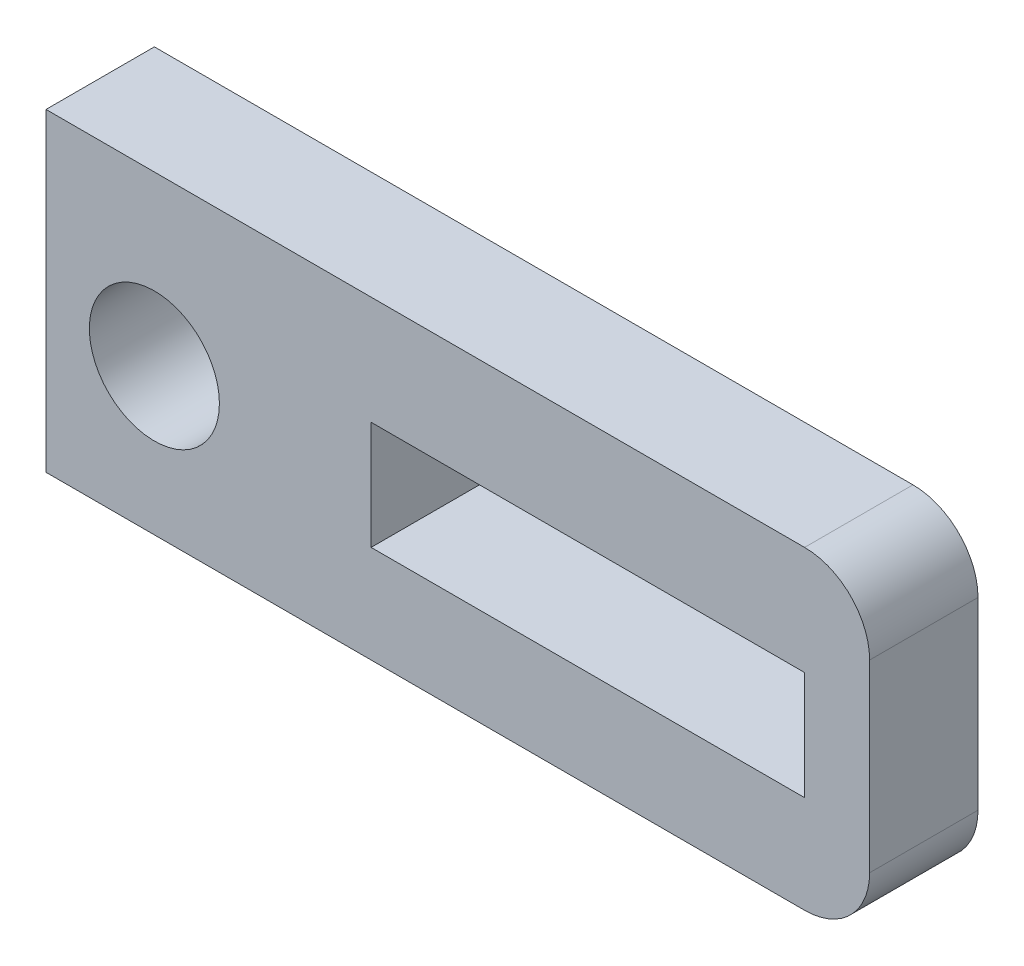
ISO-10303-21;
HEADER;
FILE_DESCRIPTION(('STEP AP214'),'2;1');
FILE_NAME('part.step','',(''),(''),'','','');
FILE_SCHEMA(('AUTOMOTIVE_DESIGN { 1 0 10303 214 1 1 1 1 }'));
ENDSEC;
DATA;
#1=APPLICATION_CONTEXT('core data for automotive mechanical design processes');
#2=APPLICATION_PROTOCOL_DEFINITION('international standard','automotive_design',2000,#1);
#3=PRODUCT_CONTEXT('',#1,'mechanical');
#4=PRODUCT('Part','Part','',(#3));
#5=PRODUCT_RELATED_PRODUCT_CATEGORY('part','',(#4));
#6=PRODUCT_DEFINITION_FORMATION('','',#4);
#7=PRODUCT_DEFINITION_CONTEXT('part definition',#1,'design');
#8=PRODUCT_DEFINITION('design','',#6,#7);
#9=PRODUCT_DEFINITION_SHAPE('','',#8);
#10=(LENGTH_UNIT() NAMED_UNIT(*) SI_UNIT(.MILLI.,.METRE.));
#11=(NAMED_UNIT(*) PLANE_ANGLE_UNIT() SI_UNIT($,.RADIAN.));
#12=(NAMED_UNIT(*) SI_UNIT($,.STERADIAN.) SOLID_ANGLE_UNIT());
#13=UNCERTAINTY_MEASURE_WITH_UNIT(LENGTH_MEASURE(1.E-05),#10,'distance_accuracy_value','');
#14=(GEOMETRIC_REPRESENTATION_CONTEXT(3) GLOBAL_UNCERTAINTY_ASSIGNED_CONTEXT((#13)) GLOBAL_UNIT_ASSIGNED_CONTEXT((#10,
#11,#12)) REPRESENTATION_CONTEXT('',''));
#15=CARTESIAN_POINT('',(0.,0.,0.));
#16=DIRECTION('',(0.,0.,1.));
#17=DIRECTION('',(1.,0.,0.));
#18=AXIS2_PLACEMENT_3D('',#15,#16,#17);
#19=CARTESIAN_POINT('',(57.,0.,5.));
#20=DIRECTION('',(1.,0.,0.));
#21=DIRECTION('',(0.,1.,0.));
#22=AXIS2_PLACEMENT_3D('',#19,#20,#21);
#23=PLANE('',#22);
#24=DIRECTION('',(0.,-1.,0.));
#25=VECTOR('',#24,1.);
#26=CARTESIAN_POINT('',(57.,0.,0.));
#27=LINE('',#26,#25);
#28=CARTESIAN_POINT('',(57.,9.99999999999999,0.));
#29=VERTEX_POINT('',#28);
#30=CARTESIAN_POINT('',(57.,5.,0.));
#31=VERTEX_POINT('',#30);
#32=EDGE_CURVE('E167',#29,#31,#27,.T.);
#33=ORIENTED_EDGE('',*,*,#32,.F.);
#34=DIRECTION('',(0.,0.,-1.));
#35=VECTOR('',#34,1.);
#36=CARTESIAN_POINT('',(57.,9.99999999999999,5.));
#37=LINE('',#36,#35);
#38=CARTESIAN_POINT('',(57.,9.99999999999999,5.));
#39=VERTEX_POINT('',#38);
#40=EDGE_CURVE('E11',#39,#29,#37,.T.);
#41=ORIENTED_EDGE('',*,*,#40,.F.);
#42=DIRECTION('',(0.,-1.,0.));
#43=VECTOR('',#42,1.);
#44=CARTESIAN_POINT('',(57.,0.,5.));
#45=LINE('',#44,#43);
#46=CARTESIAN_POINT('',(57.,5.,5.));
#47=VERTEX_POINT('',#46);
#48=EDGE_CURVE('E138',#39,#47,#45,.T.);
#49=ORIENTED_EDGE('',*,*,#48,.T.);
#50=DIRECTION('',(0.,0.,-1.));
#51=VECTOR('',#50,1.);
#52=CARTESIAN_POINT('',(57.,5.,5.));
#53=LINE('',#52,#51);
#54=EDGE_CURVE('E94',#47,#31,#53,.T.);
#55=ORIENTED_EDGE('',*,*,#54,.T.);
#56=EDGE_LOOP('',(#33,#41,#49,#55));
#57=FACE_BOUND('',#56,.T.);
#58=ADVANCED_FACE('F34',(#57),#23,.T.);
#59=CARTESIAN_POINT('',(0.,9.99999999999999,5.));
#60=DIRECTION('',(0.,-1.,0.));
#61=DIRECTION('',(1.,0.,0.));
#62=AXIS2_PLACEMENT_3D('',#59,#60,#61);
#63=PLANE('',#62);
#64=DIRECTION('',(-1.,0.,0.));
#65=VECTOR('',#64,1.);
#66=CARTESIAN_POINT('',(0.,9.99999999999999,0.));
#67=LINE('',#66,#65);
#68=CARTESIAN_POINT('',(77.,10.,0.));
#69=VERTEX_POINT('',#68);
#70=EDGE_CURVE('E128',#69,#29,#67,.T.);
#71=ORIENTED_EDGE('',*,*,#70,.F.);
#72=DIRECTION('',(0.,0.,-1.));
#73=VECTOR('',#72,1.);
#74=CARTESIAN_POINT('',(77.,10.,5.));
#75=LINE('',#74,#73);
#76=CARTESIAN_POINT('',(77.,10.,5.));
#77=VERTEX_POINT('',#76);
#78=EDGE_CURVE('E44',#77,#69,#75,.T.);
#79=ORIENTED_EDGE('',*,*,#78,.F.);
#80=DIRECTION('',(-1.,0.,0.));
#81=VECTOR('',#80,1.);
#82=CARTESIAN_POINT('',(0.,9.99999999999999,5.));
#83=LINE('',#82,#81);
#84=EDGE_CURVE('E126',#77,#39,#83,.T.);
#85=ORIENTED_EDGE('',*,*,#84,.T.);
#86=ORIENTED_EDGE('',*,*,#40,.T.);
#87=EDGE_LOOP('',(#71,#79,#85,#86));
#88=FACE_BOUND('',#87,.T.);
#89=ADVANCED_FACE('F124',(#88),#63,.T.);
#90=CARTESIAN_POINT('',(77.,0.,5.));
#91=DIRECTION('',(1.,0.,0.));
#92=DIRECTION('',(0.,0.,-1.));
#93=AXIS2_PLACEMENT_3D('',#90,#91,#92);
#94=PLANE('',#93);
#95=DIRECTION('',(0.,-1.,0.));
#96=VECTOR('',#95,1.);
#97=CARTESIAN_POINT('',(77.,0.,0.));
#98=LINE('',#97,#96);
#99=CARTESIAN_POINT('',(77.,5.,0.));
#100=VERTEX_POINT('',#99);
#101=EDGE_CURVE('E170',#69,#100,#98,.T.);
#102=ORIENTED_EDGE('',*,*,#101,.T.);
#103=DIRECTION('',(0.,0.,-1.));
#104=VECTOR('',#103,1.);
#105=CARTESIAN_POINT('',(77.,5.,5.));
#106=LINE('',#105,#104);
#107=CARTESIAN_POINT('',(77.,5.,5.));
#108=VERTEX_POINT('',#107);
#109=EDGE_CURVE('E131',#108,#100,#106,.T.);
#110=ORIENTED_EDGE('',*,*,#109,.F.);
#111=DIRECTION('',(0.,-1.,0.));
#112=VECTOR('',#111,1.);
#113=CARTESIAN_POINT('',(77.,0.,5.));
#114=LINE('',#113,#112);
#115=EDGE_CURVE('E134',#77,#108,#114,.T.);
#116=ORIENTED_EDGE('',*,*,#115,.F.);
#117=ORIENTED_EDGE('',*,*,#78,.T.);
#118=EDGE_LOOP('',(#102,#110,#116,#117));
#119=FACE_BOUND('',#118,.T.);
#120=ADVANCED_FACE('F135',(#119),#94,.F.);
#121=CARTESIAN_POINT('',(77.,3.5,5.));
#122=DIRECTION('',(0.,0.,-1.));
#123=DIRECTION('',(-1.,0.,0.));
#124=AXIS2_PLACEMENT_3D('',#121,#122,#123);
#125=CYLINDRICAL_SURFACE('',#124,3.);
#126=CARTESIAN_POINT('',(77.,3.5,0.));
#127=DIRECTION('',(0.,0.,1.));
#128=DIRECTION('',(1.,0.,0.));
#129=AXIS2_PLACEMENT_3D('',#126,#127,#128);
#130=CIRCLE('',#129,3.);
#131=CARTESIAN_POINT('',(80.,3.5,0.));
#132=VERTEX_POINT('',#131);
#133=CARTESIAN_POINT('',(77.,0.499999999999999,0.));
#134=VERTEX_POINT('',#133);
#135=EDGE_CURVE('E149',#132,#134,#130,.F.);
#136=ORIENTED_EDGE('',*,*,#135,.F.);
#137=DIRECTION('',(0.,0.,-1.));
#138=VECTOR('',#137,1.);
#139=CARTESIAN_POINT('',(80.,3.5,5.));
#140=LINE('',#139,#138);
#141=CARTESIAN_POINT('',(80.,3.5,5.));
#142=VERTEX_POINT('',#141);
#143=EDGE_CURVE('E38',#142,#132,#140,.T.);
#144=ORIENTED_EDGE('',*,*,#143,.F.);
#145=CARTESIAN_POINT('',(77.,3.5,5.));
#146=DIRECTION('',(0.,0.,1.));
#147=DIRECTION('',(1.,0.,0.));
#148=AXIS2_PLACEMENT_3D('',#145,#146,#147);
#149=CIRCLE('',#148,3.);
#150=CARTESIAN_POINT('',(77.,0.499999999999999,5.));
#151=VERTEX_POINT('',#150);
#152=EDGE_CURVE('E197',#142,#151,#149,.F.);
#153=ORIENTED_EDGE('',*,*,#152,.T.);
#154=DIRECTION('',(0.,0.,-1.));
#155=VECTOR('',#154,1.);
#156=CARTESIAN_POINT('',(77.,0.499999999999999,5.));
#157=LINE('',#156,#155);
#158=EDGE_CURVE('E145',#151,#134,#157,.T.);
#159=ORIENTED_EDGE('',*,*,#158,.T.);
#160=EDGE_LOOP('',(#136,#144,#153,#159));
#161=FACE_BOUND('',#160,.T.);
#162=ADVANCED_FACE('F195',(#161),#125,.T.);
#163=CARTESIAN_POINT('',(80.,0.,5.));
#164=DIRECTION('',(-1.,0.,0.));
#165=DIRECTION('',(0.,0.,1.));
#166=AXIS2_PLACEMENT_3D('',#163,#164,#165);
#167=PLANE('',#166);
#168=DIRECTION('',(0.,1.,0.));
#169=VECTOR('',#168,1.);
#170=CARTESIAN_POINT('',(80.,0.,0.));
#171=LINE('',#170,#169);
#172=CARTESIAN_POINT('',(80.,12.,0.));
#173=VERTEX_POINT('',#172);
#174=EDGE_CURVE('E152',#132,#173,#171,.T.);
#175=ORIENTED_EDGE('',*,*,#174,.T.);
#176=DIRECTION('',(0.,0.,-1.));
#177=VECTOR('',#176,1.);
#178=CARTESIAN_POINT('',(80.,12.,5.));
#179=LINE('',#178,#177);
#180=CARTESIAN_POINT('',(80.,12.,5.));
#181=VERTEX_POINT('',#180);
#182=EDGE_CURVE('E183',#181,#173,#179,.T.);
#183=ORIENTED_EDGE('',*,*,#182,.F.);
#184=DIRECTION('',(0.,1.,0.));
#185=VECTOR('',#184,1.);
#186=CARTESIAN_POINT('',(80.,0.,5.));
#187=LINE('',#186,#185);
#188=EDGE_CURVE('E191',#142,#181,#187,.T.);
#189=ORIENTED_EDGE('',*,*,#188,.F.);
#190=ORIENTED_EDGE('',*,*,#143,.T.);
#191=EDGE_LOOP('',(#175,#183,#189,#190));
#192=FACE_BOUND('',#191,.T.);
#193=ADVANCED_FACE('F189',(#192),#167,.F.);
#194=CARTESIAN_POINT('',(77.,12.,5.));
#195=DIRECTION('',(0.,0.,-1.));
#196=DIRECTION('',(-1.,0.,0.));
#197=AXIS2_PLACEMENT_3D('',#194,#195,#196);
#198=CYLINDRICAL_SURFACE('',#197,3.);
#199=CARTESIAN_POINT('',(77.,12.,0.));
#200=DIRECTION('',(0.,0.,1.));
#201=DIRECTION('',(1.,0.,0.));
#202=AXIS2_PLACEMENT_3D('',#199,#200,#201);
#203=CIRCLE('',#202,3.);
#204=CARTESIAN_POINT('',(77.,15.,0.));
#205=VERTEX_POINT('',#204);
#206=EDGE_CURVE('E155',#173,#205,#203,.T.);
#207=ORIENTED_EDGE('',*,*,#206,.T.);
#208=DIRECTION('',(0.,0.,-1.));
#209=VECTOR('',#208,1.);
#210=CARTESIAN_POINT('',(77.,15.,5.));
#211=LINE('',#210,#209);
#212=CARTESIAN_POINT('',(77.,15.,5.));
#213=VERTEX_POINT('',#212);
#214=EDGE_CURVE('E182',#213,#205,#211,.T.);
#215=ORIENTED_EDGE('',*,*,#214,.F.);
#216=CARTESIAN_POINT('',(77.,12.,5.));
#217=DIRECTION('',(0.,0.,1.));
#218=DIRECTION('',(1.,0.,0.));
#219=AXIS2_PLACEMENT_3D('',#216,#217,#218);
#220=CIRCLE('',#219,3.);
#221=EDGE_CURVE('E336',#181,#213,#220,.T.);
#222=ORIENTED_EDGE('',*,*,#221,.F.);
#223=ORIENTED_EDGE('',*,*,#182,.T.);
#224=EDGE_LOOP('',(#207,#215,#222,#223));
#225=FACE_BOUND('',#224,.T.);
#226=ADVANCED_FACE('F211',(#225),#198,.T.);
#227=CARTESIAN_POINT('',(0.,15.,5.));
#228=DIRECTION('',(0.,1.,0.));
#229=DIRECTION('',(-1.,0.,0.));
#230=AXIS2_PLACEMENT_3D('',#227,#228,#229);
#231=PLANE('',#230);
#232=DIRECTION('',(1.,0.,0.));
#233=VECTOR('',#232,1.);
#234=CARTESIAN_POINT('',(0.,15.,0.));
#235=LINE('',#234,#233);
#236=CARTESIAN_POINT('',(42.,15.,0.));
#237=VERTEX_POINT('',#236);
#238=EDGE_CURVE('E158',#237,#205,#235,.T.);
#239=ORIENTED_EDGE('',*,*,#238,.F.);
#240=DIRECTION('',(0.,0.,-1.));
#241=VECTOR('',#240,1.);
#242=CARTESIAN_POINT('',(42.,15.,5.));
#243=LINE('',#242,#241);
#244=CARTESIAN_POINT('',(42.,15.,5.));
#245=VERTEX_POINT('',#244);
#246=EDGE_CURVE('E180',#245,#237,#243,.T.);
#247=ORIENTED_EDGE('',*,*,#246,.F.);
#248=DIRECTION('',(1.,0.,0.));
#249=VECTOR('',#248,1.);
#250=CARTESIAN_POINT('',(0.,15.,5.));
#251=LINE('',#250,#249);
#252=EDGE_CURVE('E210',#245,#213,#251,.T.);
#253=ORIENTED_EDGE('',*,*,#252,.T.);
#254=ORIENTED_EDGE('',*,*,#214,.T.);
#255=EDGE_LOOP('',(#239,#247,#253,#254));
#256=FACE_BOUND('',#255,.T.);
#257=ADVANCED_FACE('F205',(#256),#231,.T.);
#258=CARTESIAN_POINT('',(42.,0.,5.));
#259=DIRECTION('',(1.,0.,0.));
#260=DIRECTION('',(0.,1.,0.));
#261=AXIS2_PLACEMENT_3D('',#258,#259,#260);
#262=PLANE('',#261);
#263=DIRECTION('',(0.,-1.,0.));
#264=VECTOR('',#263,1.);
#265=CARTESIAN_POINT('',(42.,0.,0.));
#266=LINE('',#265,#264);
#267=CARTESIAN_POINT('',(42.,0.499999999999999,0.));
#268=VERTEX_POINT('',#267);
#269=EDGE_CURVE('E161',#237,#268,#266,.T.);
#270=ORIENTED_EDGE('',*,*,#269,.T.);
#271=DIRECTION('',(0.,0.,-1.));
#272=VECTOR('',#271,1.);
#273=CARTESIAN_POINT('',(42.,0.499999999999999,5.));
#274=LINE('',#273,#272);
#275=CARTESIAN_POINT('',(42.,0.499999999999999,5.));
#276=VERTEX_POINT('',#275);
#277=EDGE_CURVE('E177',#276,#268,#274,.T.);
#278=ORIENTED_EDGE('',*,*,#277,.F.);
#279=DIRECTION('',(0.,-1.,0.));
#280=VECTOR('',#279,1.);
#281=CARTESIAN_POINT('',(42.,0.,5.));
#282=LINE('',#281,#280);
#283=EDGE_CURVE('E342',#245,#276,#282,.T.);
#284=ORIENTED_EDGE('',*,*,#283,.F.);
#285=ORIENTED_EDGE('',*,*,#246,.T.);
#286=EDGE_LOOP('',(#270,#278,#284,#285));
#287=FACE_BOUND('',#286,.T.);
#288=ADVANCED_FACE('F218',(#287),#262,.F.);
#289=CARTESIAN_POINT('',(0.,0.499999999999999,5.));
#290=DIRECTION('',(0.,1.,0.));
#291=DIRECTION('',(0.,0.,1.));
#292=AXIS2_PLACEMENT_3D('',#289,#290,#291);
#293=PLANE('',#292);
#294=DIRECTION('',(1.,0.,0.));
#295=VECTOR('',#294,1.);
#296=CARTESIAN_POINT('',(0.,0.499999999999999,0.));
#297=LINE('',#296,#295);
#298=EDGE_CURVE('E164',#268,#134,#297,.T.);
#299=ORIENTED_EDGE('',*,*,#298,.T.);
#300=ORIENTED_EDGE('',*,*,#158,.F.);
#301=DIRECTION('',(1.,0.,0.));
#302=VECTOR('',#301,1.);
#303=CARTESIAN_POINT('',(0.,0.499999999999999,5.));
#304=LINE('',#303,#302);
#305=EDGE_CURVE('E140',#276,#151,#304,.T.);
#306=ORIENTED_EDGE('',*,*,#305,.F.);
#307=ORIENTED_EDGE('',*,*,#277,.T.);
#308=EDGE_LOOP('',(#299,#300,#306,#307));
#309=FACE_BOUND('',#308,.T.);
#310=ADVANCED_FACE('F199',(#309),#293,.F.);
#311=CARTESIAN_POINT('',(47.,7.25,5.));
#312=DIRECTION('',(0.,0.,-1.));
#313=DIRECTION('',(-1.,0.,0.));
#314=AXIS2_PLACEMENT_3D('',#311,#312,#313);
#315=CYLINDRICAL_SURFACE('',#314,3.);
#316=CARTESIAN_POINT('',(47.,7.25,5.));
#317=DIRECTION('',(0.,0.,1.));
#318=DIRECTION('',(1.,0.,0.));
#319=AXIS2_PLACEMENT_3D('',#316,#317,#318);
#320=CIRCLE('',#319,3.);
#321=CARTESIAN_POINT('',(50.,7.25,5.));
#322=VERTEX_POINT('',#321);
#323=EDGE_CURVE('E173',#322,#322,#320,.T.);
#324=ORIENTED_EDGE('',*,*,#323,.T.);
#325=EDGE_LOOP('',(#324));
#326=FACE_BOUND('',#325,.T.);
#327=CARTESIAN_POINT('',(47.,7.25,0.));
#328=DIRECTION('',(0.,0.,1.));
#329=DIRECTION('',(1.,0.,0.));
#330=AXIS2_PLACEMENT_3D('',#327,#328,#329);
#331=CIRCLE('',#330,3.);
#332=CARTESIAN_POINT('',(50.,7.25,0.));
#333=VERTEX_POINT('',#332);
#334=EDGE_CURVE('E146',#333,#333,#331,.T.);
#335=ORIENTED_EDGE('',*,*,#334,.F.);
#336=EDGE_LOOP('',(#335));
#337=FACE_BOUND('',#336,.T.);
#338=ADVANCED_FACE('F36',(#326,#337),#315,.F.);
#339=CARTESIAN_POINT('',(0.,4.99999999999999,5.));
#340=DIRECTION('',(0.,-1.,0.));
#341=DIRECTION('',(1.,0.,0.));
#342=AXIS2_PLACEMENT_3D('',#339,#340,#341);
#343=PLANE('',#342);
#344=DIRECTION('',(-1.,0.,0.));
#345=VECTOR('',#344,1.);
#346=CARTESIAN_POINT('',(0.,4.99999999999999,0.));
#347=LINE('',#346,#345);
#348=EDGE_CURVE('E87',#100,#31,#347,.T.);
#349=ORIENTED_EDGE('',*,*,#348,.T.);
#350=ORIENTED_EDGE('',*,*,#54,.F.);
#351=DIRECTION('',(-1.,0.,0.));
#352=VECTOR('',#351,1.);
#353=CARTESIAN_POINT('',(0.,4.99999999999999,5.));
#354=LINE('',#353,#352);
#355=EDGE_CURVE('E53',#108,#47,#354,.T.);
#356=ORIENTED_EDGE('',*,*,#355,.F.);
#357=ORIENTED_EDGE('',*,*,#109,.T.);
#358=EDGE_LOOP('',(#349,#350,#356,#357));
#359=FACE_BOUND('',#358,.T.);
#360=ADVANCED_FACE('F246',(#359),#343,.F.);
#361=CARTESIAN_POINT('',(0.,0.,5.));
#362=DIRECTION('',(0.,0.,1.));
#363=DIRECTION('',(1.,0.,0.));
#364=AXIS2_PLACEMENT_3D('',#361,#362,#363);
#365=PLANE('',#364);
#366=ORIENTED_EDGE('',*,*,#323,.F.);
#367=EDGE_LOOP('',(#366));
#368=FACE_BOUND('',#367,.T.);
#369=ORIENTED_EDGE('',*,*,#152,.F.);
#370=ORIENTED_EDGE('',*,*,#188,.T.);
#371=ORIENTED_EDGE('',*,*,#221,.T.);
#372=ORIENTED_EDGE('',*,*,#252,.F.);
#373=ORIENTED_EDGE('',*,*,#283,.T.);
#374=ORIENTED_EDGE('',*,*,#305,.T.);
#375=EDGE_LOOP('',(#369,#370,#371,#372,#373,#374));
#376=FACE_BOUND('',#375,.T.);
#377=ORIENTED_EDGE('',*,*,#48,.F.);
#378=ORIENTED_EDGE('',*,*,#84,.F.);
#379=ORIENTED_EDGE('',*,*,#115,.T.);
#380=ORIENTED_EDGE('',*,*,#355,.T.);
#381=EDGE_LOOP('',(#377,#378,#379,#380));
#382=FACE_BOUND('',#381,.T.);
#383=ADVANCED_FACE('F137',(#368,#376,#382),#365,.T.);
#384=CARTESIAN_POINT('',(0.,0.,0.));
#385=DIRECTION('',(0.,0.,1.));
#386=DIRECTION('',(1.,0.,0.));
#387=AXIS2_PLACEMENT_3D('',#384,#385,#386);
#388=PLANE('',#387);
#389=ORIENTED_EDGE('',*,*,#334,.T.);
#390=EDGE_LOOP('',(#389));
#391=FACE_BOUND('',#390,.T.);
#392=ORIENTED_EDGE('',*,*,#135,.T.);
#393=ORIENTED_EDGE('',*,*,#298,.F.);
#394=ORIENTED_EDGE('',*,*,#269,.F.);
#395=ORIENTED_EDGE('',*,*,#238,.T.);
#396=ORIENTED_EDGE('',*,*,#206,.F.);
#397=ORIENTED_EDGE('',*,*,#174,.F.);
#398=EDGE_LOOP('',(#392,#393,#394,#395,#396,#397));
#399=FACE_BOUND('',#398,.T.);
#400=ORIENTED_EDGE('',*,*,#32,.T.);
#401=ORIENTED_EDGE('',*,*,#348,.F.);
#402=ORIENTED_EDGE('',*,*,#101,.F.);
#403=ORIENTED_EDGE('',*,*,#70,.T.);
#404=EDGE_LOOP('',(#400,#401,#402,#403));
#405=FACE_BOUND('',#404,.T.);
#406=ADVANCED_FACE('F194',(#391,#399,#405),#388,.F.);
#407=CLOSED_SHELL('',(#58,#89,#120,#162,#193,#226,#257,#288,#310,#338,#360,#383,#406));
#408=MANIFOLD_SOLID_BREP('B2',#407);
#409=ADVANCED_BREP_SHAPE_REPRESENTATION('',(#18,#408),#14);
#410=SHAPE_DEFINITION_REPRESENTATION(#9,#409);
ENDSEC;
END-ISO-10303-21;
